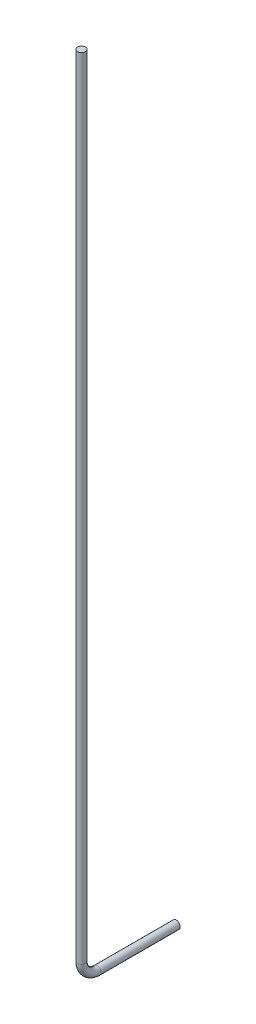
ISO-10303-21;
HEADER;
FILE_DESCRIPTION(('STEP AP214'),'2;1');
FILE_NAME('part.step','',(''),(''),'','','');
FILE_SCHEMA(('AUTOMOTIVE_DESIGN { 1 0 10303 214 1 1 1 1 }'));
ENDSEC;
DATA;
#1=APPLICATION_CONTEXT('core data for automotive mechanical design processes');
#2=APPLICATION_PROTOCOL_DEFINITION('international standard','automotive_design',2000,#1);
#3=PRODUCT_CONTEXT('',#1,'mechanical');
#4=PRODUCT('Part','Part','',(#3));
#5=PRODUCT_RELATED_PRODUCT_CATEGORY('part','',(#4));
#6=PRODUCT_DEFINITION_FORMATION('','',#4);
#7=PRODUCT_DEFINITION_CONTEXT('part definition',#1,'design');
#8=PRODUCT_DEFINITION('design','',#6,#7);
#9=PRODUCT_DEFINITION_SHAPE('','',#8);
#10=(LENGTH_UNIT() NAMED_UNIT(*) SI_UNIT(.MILLI.,.METRE.));
#11=(NAMED_UNIT(*) PLANE_ANGLE_UNIT() SI_UNIT($,.RADIAN.));
#12=(NAMED_UNIT(*) SI_UNIT($,.STERADIAN.) SOLID_ANGLE_UNIT());
#13=UNCERTAINTY_MEASURE_WITH_UNIT(LENGTH_MEASURE(1.E-05),#10,'distance_accuracy_value','');
#14=(GEOMETRIC_REPRESENTATION_CONTEXT(3) GLOBAL_UNCERTAINTY_ASSIGNED_CONTEXT((#13)) GLOBAL_UNIT_ASSIGNED_CONTEXT((#10,
#11,#12)) REPRESENTATION_CONTEXT('',''));
#15=CARTESIAN_POINT('',(0.,0.,0.));
#16=DIRECTION('',(0.,0.,1.));
#17=DIRECTION('',(1.,0.,0.));
#18=AXIS2_PLACEMENT_3D('',#15,#16,#17);
#19=CARTESIAN_POINT('',(0.,0.,20.));
#20=DIRECTION('',(0.,0.,-1.));
#21=DIRECTION('',(-1.,0.,0.));
#22=AXIS2_PLACEMENT_3D('',#19,#20,#21);
#23=CYLINDRICAL_SURFACE('',#22,1.27);
#24=CARTESIAN_POINT('',(0.,0.,0.));
#25=DIRECTION('',(0.,0.,1.));
#26=DIRECTION('',(1.,0.,0.));
#27=AXIS2_PLACEMENT_3D('',#24,#25,#26);
#28=CIRCLE('',#27,1.27);
#29=CARTESIAN_POINT('',(1.27,0.,0.));
#30=VERTEX_POINT('',#29);
#31=EDGE_CURVE('E10',#30,#30,#28,.T.);
#32=ORIENTED_EDGE('',*,*,#31,.T.);
#33=EDGE_LOOP('',(#32));
#34=FACE_BOUND('',#33,.T.);
#35=CARTESIAN_POINT('',(0.,0.,25.));
#36=DIRECTION('',(0.,0.,1.));
#37=DIRECTION('',(1.,0.,0.));
#38=AXIS2_PLACEMENT_3D('',#35,#36,#37);
#39=CIRCLE('',#38,1.27);
#40=CARTESIAN_POINT('',(0.,-1.26999999999984,25.));
#41=VERTEX_POINT('',#40);
#42=EDGE_CURVE('E48',#41,#41,#39,.T.);
#43=ORIENTED_EDGE('',*,*,#42,.F.);
#44=EDGE_LOOP('',(#43));
#45=FACE_BOUND('',#44,.T.);
#46=ADVANCED_FACE('F34',(#34,#45),#23,.T.);
#47=CARTESIAN_POINT('',(0.,0.,0.));
#48=DIRECTION('',(0.,0.,1.));
#49=DIRECTION('',(1.,0.,0.));
#50=AXIS2_PLACEMENT_3D('',#47,#48,#49);
#51=PLANE('',#50);
#52=ORIENTED_EDGE('',*,*,#31,.F.);
#53=EDGE_LOOP('',(#52));
#54=FACE_BOUND('',#53,.T.);
#55=ADVANCED_FACE('F57',(#54),#51,.F.);
#56=CARTESIAN_POINT('',(0.,255.,30.));
#57=DIRECTION('',(0.,1.,0.));
#58=DIRECTION('',(1.,0.,0.));
#59=AXIS2_PLACEMENT_3D('',#56,#57,#58);
#60=PLANE('',#59);
#61=CARTESIAN_POINT('',(0.,255.,30.));
#62=DIRECTION('',(0.,1.,0.));
#63=DIRECTION('',(1.,0.,0.));
#64=AXIS2_PLACEMENT_3D('',#61,#62,#63);
#65=CIRCLE('',#64,1.27);
#66=CARTESIAN_POINT('',(1.27,255.,30.));
#67=VERTEX_POINT('',#66);
#68=EDGE_CURVE('E40',#67,#67,#65,.T.);
#69=ORIENTED_EDGE('',*,*,#68,.T.);
#70=EDGE_LOOP('',(#69));
#71=FACE_BOUND('',#70,.T.);
#72=ADVANCED_FACE('F61',(#71),#60,.T.);
#73=CARTESIAN_POINT('',(0.,5.,25.));
#74=DIRECTION('',(-1.,0.,0.));
#75=DIRECTION('',(0.,0.,1.));
#76=AXIS2_PLACEMENT_3D('',#73,#74,#75);
#77=TOROIDAL_SURFACE('',#76,4.99999999999984,1.27);
#78=CARTESIAN_POINT('',(0.,5.,30.));
#79=DIRECTION('',(0.,1.,0.));
#80=DIRECTION('',(1.,0.,0.));
#81=AXIS2_PLACEMENT_3D('',#78,#79,#80);
#82=CIRCLE('',#81,1.27);
#83=CARTESIAN_POINT('',(0.,5.,31.2699999999998));
#84=VERTEX_POINT('',#83);
#85=EDGE_CURVE('E44',#84,#84,#82,.T.);
#86=CARTESIAN_POINT('',(0.,5.,25.));
#87=DIRECTION('',(-1.,0.,0.));
#88=DIRECTION('',(0.,0.,1.));
#89=AXIS2_PLACEMENT_3D('',#86,#87,#88);
#90=CIRCLE('',#89,6.26999999999984);
#91=EDGE_CURVE('',#41,#84,#90,.T.);
#92=ORIENTED_EDGE('',*,*,#42,.T.);
#93=ORIENTED_EDGE('',*,*,#85,.F.);
#94=ORIENTED_EDGE('',*,*,#91,.T.);
#95=ORIENTED_EDGE('',*,*,#91,.F.);
#96=EDGE_LOOP('',(#92,#94,#93,#95));
#97=FACE_BOUND('',#96,.T.);
#98=ADVANCED_FACE('F54',(#97),#77,.T.);
#99=CARTESIAN_POINT('',(0.,5.,30.));
#100=DIRECTION('',(0.,1.,0.));
#101=DIRECTION('',(0.,0.,1.));
#102=AXIS2_PLACEMENT_3D('',#99,#100,#101);
#103=CYLINDRICAL_SURFACE('',#102,1.27);
#104=ORIENTED_EDGE('',*,*,#68,.F.);
#105=EDGE_LOOP('',(#104));
#106=FACE_BOUND('',#105,.T.);
#107=ORIENTED_EDGE('',*,*,#85,.T.);
#108=EDGE_LOOP('',(#107));
#109=FACE_BOUND('',#108,.T.);
#110=ADVANCED_FACE('F63',(#106,#109),#103,.T.);
#111=CLOSED_SHELL('',(#46,#55,#72,#98,#110));
#112=MANIFOLD_SOLID_BREP('B2',#111);
#113=ADVANCED_BREP_SHAPE_REPRESENTATION('',(#18,#112),#14);
#114=SHAPE_DEFINITION_REPRESENTATION(#9,#113);
ENDSEC;
END-ISO-10303-21;
